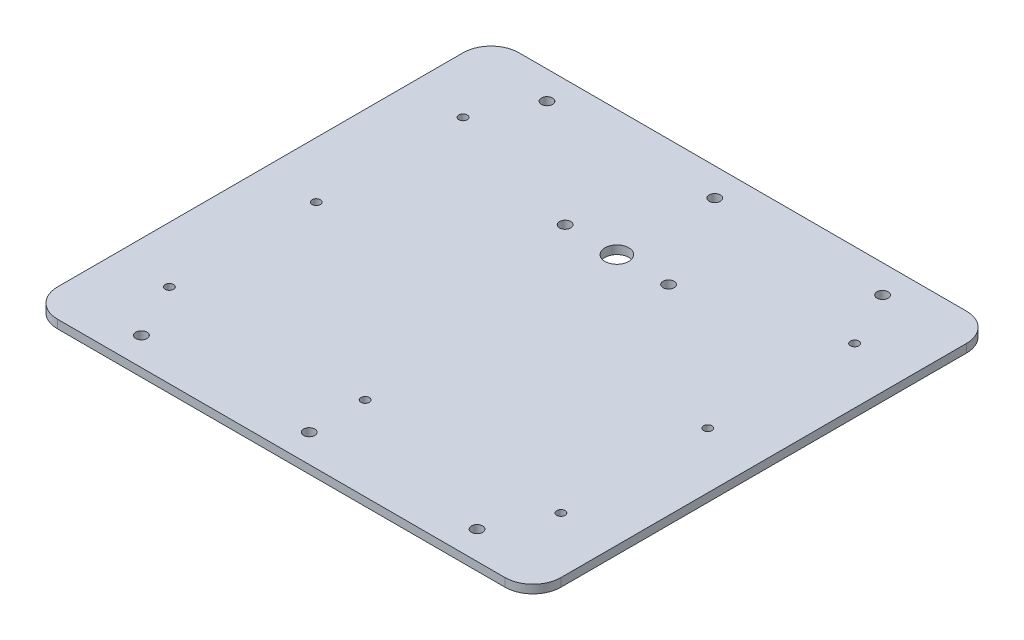
ISO-10303-21;
HEADER;
FILE_DESCRIPTION(('STEP AP214'),'2;1');
FILE_NAME('part.step','',(''),(''),'','','');
FILE_SCHEMA(('AUTOMOTIVE_DESIGN { 1 0 10303 214 1 1 1 1 }'));
ENDSEC;
DATA;
#1=APPLICATION_CONTEXT('core data for automotive mechanical design processes');
#2=APPLICATION_PROTOCOL_DEFINITION('international standard','automotive_design',2000,#1);
#3=PRODUCT_CONTEXT('',#1,'mechanical');
#4=PRODUCT('Part','Part','',(#3));
#5=PRODUCT_RELATED_PRODUCT_CATEGORY('part','',(#4));
#6=PRODUCT_DEFINITION_FORMATION('','',#4);
#7=PRODUCT_DEFINITION_CONTEXT('part definition',#1,'design');
#8=PRODUCT_DEFINITION('design','',#6,#7);
#9=PRODUCT_DEFINITION_SHAPE('','',#8);
#10=(LENGTH_UNIT() NAMED_UNIT(*) SI_UNIT(.MILLI.,.METRE.));
#11=(NAMED_UNIT(*) PLANE_ANGLE_UNIT() SI_UNIT($,.RADIAN.));
#12=(NAMED_UNIT(*) SI_UNIT($,.STERADIAN.) SOLID_ANGLE_UNIT());
#13=UNCERTAINTY_MEASURE_WITH_UNIT(LENGTH_MEASURE(1.E-05),#10,'distance_accuracy_value','');
#14=(GEOMETRIC_REPRESENTATION_CONTEXT(3) GLOBAL_UNCERTAINTY_ASSIGNED_CONTEXT((#13)) GLOBAL_UNIT_ASSIGNED_CONTEXT((#10,
#11,#12)) REPRESENTATION_CONTEXT('',''));
#15=CARTESIAN_POINT('',(0.,0.,0.));
#16=DIRECTION('',(0.,0.,1.));
#17=DIRECTION('',(1.,0.,0.));
#18=AXIS2_PLACEMENT_3D('',#15,#16,#17);
#19=CARTESIAN_POINT('',(-80.,-3.,72.5));
#20=DIRECTION('',(0.,1.,0.));
#21=DIRECTION('',(0.,0.,1.));
#22=AXIS2_PLACEMENT_3D('',#19,#20,#21);
#23=CYLINDRICAL_SURFACE('',#22,10.);
#24=CARTESIAN_POINT('',(-80.,0.,72.5));
#25=DIRECTION('',(0.,1.,0.));
#26=DIRECTION('',(0.,0.,1.));
#27=AXIS2_PLACEMENT_3D('',#24,#25,#26);
#28=CIRCLE('',#27,10.);
#29=CARTESIAN_POINT('',(-90.,0.,72.5));
#30=VERTEX_POINT('',#29);
#31=CARTESIAN_POINT('',(-79.9999999999999,0.,82.5));
#32=VERTEX_POINT('',#31);
#33=EDGE_CURVE('E134',#30,#32,#28,.T.);
#34=ORIENTED_EDGE('',*,*,#33,.F.);
#35=DIRECTION('',(0.,1.,0.));
#36=VECTOR('',#35,1.);
#37=CARTESIAN_POINT('',(-90.,-3.,72.5));
#38=LINE('',#37,#36);
#39=CARTESIAN_POINT('',(-90.,-3.,72.5));
#40=VERTEX_POINT('',#39);
#41=EDGE_CURVE('E11',#40,#30,#38,.T.);
#42=ORIENTED_EDGE('',*,*,#41,.F.);
#43=CARTESIAN_POINT('',(-80.,-3.,72.5));
#44=DIRECTION('',(0.,1.,0.));
#45=DIRECTION('',(0.,0.,1.));
#46=AXIS2_PLACEMENT_3D('',#43,#44,#45);
#47=CIRCLE('',#46,10.);
#48=CARTESIAN_POINT('',(-79.9999999999999,-3.,82.5));
#49=VERTEX_POINT('',#48);
#50=EDGE_CURVE('E155',#40,#49,#47,.T.);
#51=ORIENTED_EDGE('',*,*,#50,.T.);
#52=DIRECTION('',(0.,1.,0.));
#53=VECTOR('',#52,1.);
#54=CARTESIAN_POINT('',(-79.9999999999999,-3.,82.5));
#55=LINE('',#54,#53);
#56=EDGE_CURVE('E40',#49,#32,#55,.T.);
#57=ORIENTED_EDGE('',*,*,#56,.T.);
#58=EDGE_LOOP('',(#34,#42,#51,#57));
#59=FACE_BOUND('',#58,.T.);
#60=ADVANCED_FACE('F37',(#59),#23,.T.);
#61=CARTESIAN_POINT('',(-90.,-3.,-72.5));
#62=DIRECTION('',(-1.,0.,0.));
#63=DIRECTION('',(0.,0.,1.));
#64=AXIS2_PLACEMENT_3D('',#61,#62,#63);
#65=PLANE('',#64);
#66=DIRECTION('',(0.,0.,1.));
#67=VECTOR('',#66,1.);
#68=CARTESIAN_POINT('',(-90.,0.,-72.5));
#69=LINE('',#68,#67);
#70=CARTESIAN_POINT('',(-90.,0.,-72.5));
#71=VERTEX_POINT('',#70);
#72=EDGE_CURVE('E153',#71,#30,#69,.T.);
#73=ORIENTED_EDGE('',*,*,#72,.F.);
#74=DIRECTION('',(0.,1.,0.));
#75=VECTOR('',#74,1.);
#76=CARTESIAN_POINT('',(-90.,-3.,-72.5));
#77=LINE('',#76,#75);
#78=CARTESIAN_POINT('',(-90.,-3.,-72.5));
#79=VERTEX_POINT('',#78);
#80=EDGE_CURVE('E46',#79,#71,#77,.T.);
#81=ORIENTED_EDGE('',*,*,#80,.F.);
#82=DIRECTION('',(0.,0.,1.));
#83=VECTOR('',#82,1.);
#84=CARTESIAN_POINT('',(-90.,-3.,-72.5));
#85=LINE('',#84,#83);
#86=EDGE_CURVE('E124',#79,#40,#85,.T.);
#87=ORIENTED_EDGE('',*,*,#86,.T.);
#88=ORIENTED_EDGE('',*,*,#41,.T.);
#89=EDGE_LOOP('',(#73,#81,#87,#88));
#90=FACE_BOUND('',#89,.T.);
#91=ADVANCED_FACE('F167',(#90),#65,.T.);
#92=CARTESIAN_POINT('',(-80.,-3.,-72.5));
#93=DIRECTION('',(0.,1.,0.));
#94=DIRECTION('',(0.,0.,1.));
#95=AXIS2_PLACEMENT_3D('',#92,#93,#94);
#96=CYLINDRICAL_SURFACE('',#95,9.99999999999999);
#97=CARTESIAN_POINT('',(-80.,0.,-72.5));
#98=DIRECTION('',(0.,1.,0.));
#99=DIRECTION('',(0.,0.,1.));
#100=AXIS2_PLACEMENT_3D('',#97,#98,#99);
#101=CIRCLE('',#100,9.99999999999999);
#102=CARTESIAN_POINT('',(-80.,0.,-82.5));
#103=VERTEX_POINT('',#102);
#104=EDGE_CURVE('E111',#103,#71,#101,.T.);
#105=ORIENTED_EDGE('',*,*,#104,.F.);
#106=DIRECTION('',(0.,1.,0.));
#107=VECTOR('',#106,1.);
#108=CARTESIAN_POINT('',(-80.,-3.,-82.5));
#109=LINE('',#108,#107);
#110=CARTESIAN_POINT('',(-80.,-3.,-82.5));
#111=VERTEX_POINT('',#110);
#112=EDGE_CURVE('E106',#111,#103,#109,.T.);
#113=ORIENTED_EDGE('',*,*,#112,.F.);
#114=CARTESIAN_POINT('',(-80.,-3.,-72.5));
#115=DIRECTION('',(0.,1.,0.));
#116=DIRECTION('',(0.,0.,1.));
#117=AXIS2_PLACEMENT_3D('',#114,#115,#116);
#118=CIRCLE('',#117,9.99999999999999);
#119=EDGE_CURVE('E109',#111,#79,#118,.T.);
#120=ORIENTED_EDGE('',*,*,#119,.T.);
#121=ORIENTED_EDGE('',*,*,#80,.T.);
#122=EDGE_LOOP('',(#105,#113,#120,#121));
#123=FACE_BOUND('',#122,.T.);
#124=ADVANCED_FACE('F108',(#123),#96,.T.);
#125=CARTESIAN_POINT('',(-80.,-3.,-82.5));
#126=DIRECTION('',(0.,0.,-1.));
#127=DIRECTION('',(-1.,0.,0.));
#128=AXIS2_PLACEMENT_3D('',#125,#126,#127);
#129=PLANE('',#128);
#130=DIRECTION('',(-1.,0.,0.));
#131=VECTOR('',#130,1.);
#132=CARTESIAN_POINT('',(-80.,0.,-82.5));
#133=LINE('',#132,#131);
#134=CARTESIAN_POINT('',(80.,0.,-82.5));
#135=VERTEX_POINT('',#134);
#136=EDGE_CURVE('E150',#135,#103,#133,.T.);
#137=ORIENTED_EDGE('',*,*,#136,.F.);
#138=DIRECTION('',(0.,1.,0.));
#139=VECTOR('',#138,1.);
#140=CARTESIAN_POINT('',(80.,-3.,-82.5));
#141=LINE('',#140,#139);
#142=CARTESIAN_POINT('',(80.,-3.,-82.5));
#143=VERTEX_POINT('',#142);
#144=EDGE_CURVE('E116',#143,#135,#141,.T.);
#145=ORIENTED_EDGE('',*,*,#144,.F.);
#146=DIRECTION('',(-1.,0.,0.));
#147=VECTOR('',#146,1.);
#148=CARTESIAN_POINT('',(-80.,-3.,-82.5));
#149=LINE('',#148,#147);
#150=EDGE_CURVE('E122',#143,#111,#149,.T.);
#151=ORIENTED_EDGE('',*,*,#150,.T.);
#152=ORIENTED_EDGE('',*,*,#112,.T.);
#153=EDGE_LOOP('',(#137,#145,#151,#152));
#154=FACE_BOUND('',#153,.T.);
#155=ADVANCED_FACE('F126',(#154),#129,.T.);
#156=CARTESIAN_POINT('',(80.,-3.,-72.5));
#157=DIRECTION('',(0.,1.,0.));
#158=DIRECTION('',(0.,0.,1.));
#159=AXIS2_PLACEMENT_3D('',#156,#157,#158);
#160=CYLINDRICAL_SURFACE('',#159,10.);
#161=CARTESIAN_POINT('',(80.,0.,-72.5));
#162=DIRECTION('',(0.,1.,0.));
#163=DIRECTION('',(0.,0.,-1.));
#164=AXIS2_PLACEMENT_3D('',#161,#162,#163);
#165=CIRCLE('',#164,10.);
#166=CARTESIAN_POINT('',(90.,0.,-72.5));
#167=VERTEX_POINT('',#166);
#168=EDGE_CURVE('E147',#167,#135,#165,.T.);
#169=ORIENTED_EDGE('',*,*,#168,.F.);
#170=DIRECTION('',(0.,1.,0.));
#171=VECTOR('',#170,1.);
#172=CARTESIAN_POINT('',(90.,-3.,-72.5));
#173=LINE('',#172,#171);
#174=CARTESIAN_POINT('',(90.,-3.,-72.5));
#175=VERTEX_POINT('',#174);
#176=EDGE_CURVE('E159',#175,#167,#173,.T.);
#177=ORIENTED_EDGE('',*,*,#176,.F.);
#178=CARTESIAN_POINT('',(80.,-3.,-72.5));
#179=DIRECTION('',(0.,1.,0.));
#180=DIRECTION('',(0.,0.,-1.));
#181=AXIS2_PLACEMENT_3D('',#178,#179,#180);
#182=CIRCLE('',#181,10.);
#183=EDGE_CURVE('E127',#175,#143,#182,.T.);
#184=ORIENTED_EDGE('',*,*,#183,.T.);
#185=ORIENTED_EDGE('',*,*,#144,.T.);
#186=EDGE_LOOP('',(#169,#177,#184,#185));
#187=FACE_BOUND('',#186,.T.);
#188=ADVANCED_FACE('F180',(#187),#160,.T.);
#189=CARTESIAN_POINT('',(90.,-3.,-72.5));
#190=DIRECTION('',(1.,0.,0.));
#191=DIRECTION('',(0.,0.,-1.));
#192=AXIS2_PLACEMENT_3D('',#189,#190,#191);
#193=PLANE('',#192);
#194=DIRECTION('',(0.,0.,-1.));
#195=VECTOR('',#194,1.);
#196=CARTESIAN_POINT('',(90.,0.,-72.5));
#197=LINE('',#196,#195);
#198=CARTESIAN_POINT('',(90.,0.,72.5));
#199=VERTEX_POINT('',#198);
#200=EDGE_CURVE('E144',#199,#167,#197,.T.);
#201=ORIENTED_EDGE('',*,*,#200,.F.);
#202=DIRECTION('',(0.,1.,0.));
#203=VECTOR('',#202,1.);
#204=CARTESIAN_POINT('',(90.,-3.,72.5));
#205=LINE('',#204,#203);
#206=CARTESIAN_POINT('',(90.,-3.,72.5));
#207=VERTEX_POINT('',#206);
#208=EDGE_CURVE('E161',#207,#199,#205,.T.);
#209=ORIENTED_EDGE('',*,*,#208,.F.);
#210=DIRECTION('',(0.,0.,-1.));
#211=VECTOR('',#210,1.);
#212=CARTESIAN_POINT('',(90.,-3.,-72.5));
#213=LINE('',#212,#211);
#214=EDGE_CURVE('E129',#207,#175,#213,.T.);
#215=ORIENTED_EDGE('',*,*,#214,.T.);
#216=ORIENTED_EDGE('',*,*,#176,.T.);
#217=EDGE_LOOP('',(#201,#209,#215,#216));
#218=FACE_BOUND('',#217,.T.);
#219=ADVANCED_FACE('F183',(#218),#193,.T.);
#220=CARTESIAN_POINT('',(80.,-3.,72.5));
#221=DIRECTION('',(0.,1.,0.));
#222=DIRECTION('',(0.,0.,1.));
#223=AXIS2_PLACEMENT_3D('',#220,#221,#222);
#224=CYLINDRICAL_SURFACE('',#223,10.);
#225=CARTESIAN_POINT('',(80.,0.,72.5));
#226=DIRECTION('',(0.,1.,0.));
#227=DIRECTION('',(0.,0.,1.));
#228=AXIS2_PLACEMENT_3D('',#225,#226,#227);
#229=CIRCLE('',#228,10.);
#230=CARTESIAN_POINT('',(79.9999999999999,0.,82.5));
#231=VERTEX_POINT('',#230);
#232=EDGE_CURVE('E141',#231,#199,#229,.T.);
#233=ORIENTED_EDGE('',*,*,#232,.F.);
#234=DIRECTION('',(0.,1.,0.));
#235=VECTOR('',#234,1.);
#236=CARTESIAN_POINT('',(79.9999999999999,-3.,82.5));
#237=LINE('',#236,#235);
#238=CARTESIAN_POINT('',(79.9999999999999,-3.,82.5));
#239=VERTEX_POINT('',#238);
#240=EDGE_CURVE('E162',#239,#231,#237,.T.);
#241=ORIENTED_EDGE('',*,*,#240,.F.);
#242=CARTESIAN_POINT('',(80.,-3.,72.5));
#243=DIRECTION('',(0.,1.,0.));
#244=DIRECTION('',(0.,0.,1.));
#245=AXIS2_PLACEMENT_3D('',#242,#243,#244);
#246=CIRCLE('',#245,10.);
#247=EDGE_CURVE('E369',#239,#207,#246,.T.);
#248=ORIENTED_EDGE('',*,*,#247,.T.);
#249=ORIENTED_EDGE('',*,*,#208,.T.);
#250=EDGE_LOOP('',(#233,#241,#248,#249));
#251=FACE_BOUND('',#250,.T.);
#252=ADVANCED_FACE('F187',(#251),#224,.T.);
#253=CARTESIAN_POINT('',(-79.9999999999999,-3.,82.5));
#254=DIRECTION('',(0.,0.,1.));
#255=DIRECTION('',(1.,0.,0.));
#256=AXIS2_PLACEMENT_3D('',#253,#254,#255);
#257=PLANE('',#256);
#258=DIRECTION('',(1.,0.,0.));
#259=VECTOR('',#258,1.);
#260=CARTESIAN_POINT('',(-79.9999999999999,0.,82.5));
#261=LINE('',#260,#259);
#262=EDGE_CURVE('E137',#32,#231,#261,.T.);
#263=ORIENTED_EDGE('',*,*,#262,.F.);
#264=ORIENTED_EDGE('',*,*,#56,.F.);
#265=DIRECTION('',(1.,0.,0.));
#266=VECTOR('',#265,1.);
#267=CARTESIAN_POINT('',(-79.9999999999999,-3.,82.5));
#268=LINE('',#267,#266);
#269=EDGE_CURVE('E367',#49,#239,#268,.T.);
#270=ORIENTED_EDGE('',*,*,#269,.T.);
#271=ORIENTED_EDGE('',*,*,#240,.T.);
#272=EDGE_LOOP('',(#263,#264,#270,#271));
#273=FACE_BOUND('',#272,.T.);
#274=ADVANCED_FACE('F164',(#273),#257,.T.);
#275=CARTESIAN_POINT('',(-80.,-3.,72.5));
#276=DIRECTION('',(0.,1.,0.));
#277=DIRECTION('',(0.,0.,1.));
#278=AXIS2_PLACEMENT_3D('',#275,#276,#277);
#279=PLANE('',#278);
#280=CARTESIAN_POINT('',(0.,-3.,52.5));
#281=DIRECTION('',(0.,1.,0.));
#282=DIRECTION('',(0.,0.,1.));
#283=AXIS2_PLACEMENT_3D('',#280,#281,#282);
#284=CIRCLE('',#283,1.5);
#285=CARTESIAN_POINT('',(0.,-3.,54.));
#286=VERTEX_POINT('',#285);
#287=EDGE_CURVE('E270',#286,#286,#284,.T.);
#288=ORIENTED_EDGE('',*,*,#287,.T.);
#289=EDGE_LOOP('',(#288));
#290=FACE_BOUND('',#289,.T.);
#291=CARTESIAN_POINT('',(-70.,-3.,52.5));
#292=DIRECTION('',(0.,1.,0.));
#293=DIRECTION('',(0.,0.,1.));
#294=AXIS2_PLACEMENT_3D('',#291,#292,#293);
#295=CIRCLE('',#294,1.5);
#296=CARTESIAN_POINT('',(-70.,-3.,54.));
#297=VERTEX_POINT('',#296);
#298=EDGE_CURVE('E278',#297,#297,#295,.T.);
#299=ORIENTED_EDGE('',*,*,#298,.T.);
#300=EDGE_LOOP('',(#299));
#301=FACE_BOUND('',#300,.T.);
#302=CARTESIAN_POINT('',(-70.,-3.,0.));
#303=DIRECTION('',(0.,1.,0.));
#304=DIRECTION('',(0.,0.,1.));
#305=AXIS2_PLACEMENT_3D('',#302,#303,#304);
#306=CIRCLE('',#305,1.5);
#307=CARTESIAN_POINT('',(-70.,-3.,1.5));
#308=VERTEX_POINT('',#307);
#309=EDGE_CURVE('E284',#308,#308,#306,.T.);
#310=ORIENTED_EDGE('',*,*,#309,.T.);
#311=EDGE_LOOP('',(#310));
#312=FACE_BOUND('',#311,.T.);
#313=CARTESIAN_POINT('',(-70.,-3.,-52.5));
#314=DIRECTION('',(0.,1.,0.));
#315=DIRECTION('',(0.,0.,1.));
#316=AXIS2_PLACEMENT_3D('',#313,#314,#315);
#317=CIRCLE('',#316,1.5);
#318=CARTESIAN_POINT('',(-70.,-3.,-51.));
#319=VERTEX_POINT('',#318);
#320=EDGE_CURVE('E290',#319,#319,#317,.T.);
#321=ORIENTED_EDGE('',*,*,#320,.T.);
#322=EDGE_LOOP('',(#321));
#323=FACE_BOUND('',#322,.T.);
#324=CARTESIAN_POINT('',(70.,-3.,-52.5));
#325=DIRECTION('',(0.,1.,0.));
#326=DIRECTION('',(0.,0.,1.));
#327=AXIS2_PLACEMENT_3D('',#324,#325,#326);
#328=CIRCLE('',#327,1.5);
#329=CARTESIAN_POINT('',(70.,-3.,-51.));
#330=VERTEX_POINT('',#329);
#331=EDGE_CURVE('E296',#330,#330,#328,.T.);
#332=ORIENTED_EDGE('',*,*,#331,.T.);
#333=EDGE_LOOP('',(#332));
#334=FACE_BOUND('',#333,.T.);
#335=CARTESIAN_POINT('',(70.,-3.,52.5));
#336=DIRECTION('',(0.,1.,0.));
#337=DIRECTION('',(0.,0.,1.));
#338=AXIS2_PLACEMENT_3D('',#335,#336,#337);
#339=CIRCLE('',#338,1.5);
#340=CARTESIAN_POINT('',(70.,-3.,54.));
#341=VERTEX_POINT('',#340);
#342=EDGE_CURVE('E302',#341,#341,#339,.T.);
#343=ORIENTED_EDGE('',*,*,#342,.T.);
#344=EDGE_LOOP('',(#343));
#345=FACE_BOUND('',#344,.T.);
#346=CARTESIAN_POINT('',(70.,-3.,0.));
#347=DIRECTION('',(0.,1.,0.));
#348=DIRECTION('',(0.,0.,1.));
#349=AXIS2_PLACEMENT_3D('',#346,#347,#348);
#350=CIRCLE('',#349,1.5);
#351=CARTESIAN_POINT('',(70.,-3.,1.5));
#352=VERTEX_POINT('',#351);
#353=EDGE_CURVE('E308',#352,#352,#350,.T.);
#354=ORIENTED_EDGE('',*,*,#353,.T.);
#355=EDGE_LOOP('',(#354));
#356=FACE_BOUND('',#355,.T.);
#357=CARTESIAN_POINT('',(-18.5,-3.,-37.5));
#358=DIRECTION('',(0.,1.,0.));
#359=DIRECTION('',(0.,0.,1.));
#360=AXIS2_PLACEMENT_3D('',#357,#358,#359);
#361=CIRCLE('',#360,2.);
#362=CARTESIAN_POINT('',(-18.5,-3.,-35.5));
#363=VERTEX_POINT('',#362);
#364=EDGE_CURVE('E314',#363,#363,#361,.T.);
#365=ORIENTED_EDGE('',*,*,#364,.T.);
#366=EDGE_LOOP('',(#365));
#367=FACE_BOUND('',#366,.T.);
#368=CARTESIAN_POINT('',(18.5,-3.,-37.5));
#369=DIRECTION('',(0.,1.,0.));
#370=DIRECTION('',(0.,0.,1.));
#371=AXIS2_PLACEMENT_3D('',#368,#369,#370);
#372=CIRCLE('',#371,2.);
#373=CARTESIAN_POINT('',(18.5,-3.,-35.5));
#374=VERTEX_POINT('',#373);
#375=EDGE_CURVE('E320',#374,#374,#372,.T.);
#376=ORIENTED_EDGE('',*,*,#375,.T.);
#377=EDGE_LOOP('',(#376));
#378=FACE_BOUND('',#377,.T.);
#379=CARTESIAN_POINT('',(0.,-3.,-37.5));
#380=DIRECTION('',(0.,1.,0.));
#381=DIRECTION('',(0.,0.,1.));
#382=AXIS2_PLACEMENT_3D('',#379,#380,#381);
#383=CIRCLE('',#382,4.25);
#384=CARTESIAN_POINT('',(0.,-3.,-33.25));
#385=VERTEX_POINT('',#384);
#386=EDGE_CURVE('E326',#385,#385,#383,.T.);
#387=ORIENTED_EDGE('',*,*,#386,.T.);
#388=EDGE_LOOP('',(#387));
#389=FACE_BOUND('',#388,.T.);
#390=CARTESIAN_POINT('',(60.,-3.,72.5));
#391=DIRECTION('',(0.,1.,0.));
#392=DIRECTION('',(0.,0.,1.));
#393=AXIS2_PLACEMENT_3D('',#390,#391,#392);
#394=CIRCLE('',#393,2.);
#395=CARTESIAN_POINT('',(60.,-3.,74.5));
#396=VERTEX_POINT('',#395);
#397=EDGE_CURVE('E332',#396,#396,#394,.T.);
#398=ORIENTED_EDGE('',*,*,#397,.T.);
#399=EDGE_LOOP('',(#398));
#400=FACE_BOUND('',#399,.T.);
#401=CARTESIAN_POINT('',(-60.,-3.,72.5));
#402=DIRECTION('',(0.,1.,0.));
#403=DIRECTION('',(0.,0.,1.));
#404=AXIS2_PLACEMENT_3D('',#401,#402,#403);
#405=CIRCLE('',#404,2.);
#406=CARTESIAN_POINT('',(-60.,-3.,74.5));
#407=VERTEX_POINT('',#406);
#408=EDGE_CURVE('E338',#407,#407,#405,.T.);
#409=ORIENTED_EDGE('',*,*,#408,.T.);
#410=EDGE_LOOP('',(#409));
#411=FACE_BOUND('',#410,.T.);
#412=CARTESIAN_POINT('',(0.,-3.,72.5));
#413=DIRECTION('',(0.,1.,0.));
#414=DIRECTION('',(0.,0.,1.));
#415=AXIS2_PLACEMENT_3D('',#412,#413,#414);
#416=CIRCLE('',#415,2.);
#417=CARTESIAN_POINT('',(0.,-3.,74.5));
#418=VERTEX_POINT('',#417);
#419=EDGE_CURVE('E344',#418,#418,#416,.T.);
#420=ORIENTED_EDGE('',*,*,#419,.T.);
#421=EDGE_LOOP('',(#420));
#422=FACE_BOUND('',#421,.T.);
#423=CARTESIAN_POINT('',(-60.,-3.,-72.5));
#424=DIRECTION('',(0.,1.,0.));
#425=DIRECTION('',(0.,0.,1.));
#426=AXIS2_PLACEMENT_3D('',#423,#424,#425);
#427=CIRCLE('',#426,2.);
#428=CARTESIAN_POINT('',(-60.,-3.,-70.5));
#429=VERTEX_POINT('',#428);
#430=EDGE_CURVE('E350',#429,#429,#427,.T.);
#431=ORIENTED_EDGE('',*,*,#430,.T.);
#432=EDGE_LOOP('',(#431));
#433=FACE_BOUND('',#432,.T.);
#434=CARTESIAN_POINT('',(60.,-3.,-72.5));
#435=DIRECTION('',(0.,1.,0.));
#436=DIRECTION('',(0.,0.,1.));
#437=AXIS2_PLACEMENT_3D('',#434,#435,#436);
#438=CIRCLE('',#437,2.);
#439=CARTESIAN_POINT('',(60.,-3.,-70.5));
#440=VERTEX_POINT('',#439);
#441=EDGE_CURVE('E356',#440,#440,#438,.T.);
#442=ORIENTED_EDGE('',*,*,#441,.T.);
#443=EDGE_LOOP('',(#442));
#444=FACE_BOUND('',#443,.T.);
#445=CARTESIAN_POINT('',(0.,-3.,-72.5));
#446=DIRECTION('',(0.,1.,0.));
#447=DIRECTION('',(0.,0.,1.));
#448=AXIS2_PLACEMENT_3D('',#445,#446,#447);
#449=CIRCLE('',#448,2.);
#450=CARTESIAN_POINT('',(0.,-3.,-70.5));
#451=VERTEX_POINT('',#450);
#452=EDGE_CURVE('E138',#451,#451,#449,.T.);
#453=ORIENTED_EDGE('',*,*,#452,.T.);
#454=EDGE_LOOP('',(#453));
#455=FACE_BOUND('',#454,.T.);
#456=ORIENTED_EDGE('',*,*,#50,.F.);
#457=ORIENTED_EDGE('',*,*,#86,.F.);
#458=ORIENTED_EDGE('',*,*,#119,.F.);
#459=ORIENTED_EDGE('',*,*,#150,.F.);
#460=ORIENTED_EDGE('',*,*,#183,.F.);
#461=ORIENTED_EDGE('',*,*,#214,.F.);
#462=ORIENTED_EDGE('',*,*,#247,.F.);
#463=ORIENTED_EDGE('',*,*,#269,.F.);
#464=EDGE_LOOP('',(#456,#457,#458,#459,#460,#461,#462,#463));
#465=FACE_BOUND('',#464,.T.);
#466=ADVANCED_FACE('F120',(#290,#301,#312,#323,#334,#345,#356,#367,#378,#389,#400,#411,#422,
#433,#444,#455,#465),#279,.F.);
#467=CARTESIAN_POINT('',(-80.,0.,72.5));
#468=DIRECTION('',(0.,1.,0.));
#469=DIRECTION('',(0.,0.,1.));
#470=AXIS2_PLACEMENT_3D('',#467,#468,#469);
#471=PLANE('',#470);
#472=CARTESIAN_POINT('',(0.,0.,52.5));
#473=DIRECTION('',(0.,1.,0.));
#474=DIRECTION('',(0.,0.,1.));
#475=AXIS2_PLACEMENT_3D('',#472,#473,#474);
#476=CIRCLE('',#475,1.5);
#477=CARTESIAN_POINT('',(0.,0.,54.));
#478=VERTEX_POINT('',#477);
#479=EDGE_CURVE('E273',#478,#478,#476,.T.);
#480=ORIENTED_EDGE('',*,*,#479,.F.);
#481=EDGE_LOOP('',(#480));
#482=FACE_BOUND('',#481,.T.);
#483=CARTESIAN_POINT('',(-70.,0.,52.5));
#484=DIRECTION('',(0.,1.,0.));
#485=DIRECTION('',(0.,0.,1.));
#486=AXIS2_PLACEMENT_3D('',#483,#484,#485);
#487=CIRCLE('',#486,1.5);
#488=CARTESIAN_POINT('',(-70.,0.,54.));
#489=VERTEX_POINT('',#488);
#490=EDGE_CURVE('E275',#489,#489,#487,.T.);
#491=ORIENTED_EDGE('',*,*,#490,.F.);
#492=EDGE_LOOP('',(#491));
#493=FACE_BOUND('',#492,.T.);
#494=CARTESIAN_POINT('',(-70.,0.,0.));
#495=DIRECTION('',(0.,1.,0.));
#496=DIRECTION('',(0.,0.,1.));
#497=AXIS2_PLACEMENT_3D('',#494,#495,#496);
#498=CIRCLE('',#497,1.5);
#499=CARTESIAN_POINT('',(-70.,0.,1.5));
#500=VERTEX_POINT('',#499);
#501=EDGE_CURVE('E281',#500,#500,#498,.T.);
#502=ORIENTED_EDGE('',*,*,#501,.F.);
#503=EDGE_LOOP('',(#502));
#504=FACE_BOUND('',#503,.T.);
#505=CARTESIAN_POINT('',(-70.,0.,-52.5));
#506=DIRECTION('',(0.,1.,0.));
#507=DIRECTION('',(0.,0.,1.));
#508=AXIS2_PLACEMENT_3D('',#505,#506,#507);
#509=CIRCLE('',#508,1.5);
#510=CARTESIAN_POINT('',(-70.,0.,-51.));
#511=VERTEX_POINT('',#510);
#512=EDGE_CURVE('E287',#511,#511,#509,.T.);
#513=ORIENTED_EDGE('',*,*,#512,.F.);
#514=EDGE_LOOP('',(#513));
#515=FACE_BOUND('',#514,.T.);
#516=CARTESIAN_POINT('',(70.,0.,-52.5));
#517=DIRECTION('',(0.,1.,0.));
#518=DIRECTION('',(0.,0.,1.));
#519=AXIS2_PLACEMENT_3D('',#516,#517,#518);
#520=CIRCLE('',#519,1.5);
#521=CARTESIAN_POINT('',(70.,0.,-51.));
#522=VERTEX_POINT('',#521);
#523=EDGE_CURVE('E293',#522,#522,#520,.T.);
#524=ORIENTED_EDGE('',*,*,#523,.F.);
#525=EDGE_LOOP('',(#524));
#526=FACE_BOUND('',#525,.T.);
#527=CARTESIAN_POINT('',(70.,0.,52.5));
#528=DIRECTION('',(0.,1.,0.));
#529=DIRECTION('',(0.,0.,1.));
#530=AXIS2_PLACEMENT_3D('',#527,#528,#529);
#531=CIRCLE('',#530,1.5);
#532=CARTESIAN_POINT('',(70.,0.,54.));
#533=VERTEX_POINT('',#532);
#534=EDGE_CURVE('E299',#533,#533,#531,.T.);
#535=ORIENTED_EDGE('',*,*,#534,.F.);
#536=EDGE_LOOP('',(#535));
#537=FACE_BOUND('',#536,.T.);
#538=CARTESIAN_POINT('',(70.,0.,0.));
#539=DIRECTION('',(0.,1.,0.));
#540=DIRECTION('',(0.,0.,1.));
#541=AXIS2_PLACEMENT_3D('',#538,#539,#540);
#542=CIRCLE('',#541,1.5);
#543=CARTESIAN_POINT('',(70.,0.,1.5));
#544=VERTEX_POINT('',#543);
#545=EDGE_CURVE('E305',#544,#544,#542,.T.);
#546=ORIENTED_EDGE('',*,*,#545,.F.);
#547=EDGE_LOOP('',(#546));
#548=FACE_BOUND('',#547,.T.);
#549=CARTESIAN_POINT('',(-18.5,0.,-37.5));
#550=DIRECTION('',(0.,1.,0.));
#551=DIRECTION('',(0.,0.,1.));
#552=AXIS2_PLACEMENT_3D('',#549,#550,#551);
#553=CIRCLE('',#552,2.);
#554=CARTESIAN_POINT('',(-18.5,0.,-35.5));
#555=VERTEX_POINT('',#554);
#556=EDGE_CURVE('E311',#555,#555,#553,.T.);
#557=ORIENTED_EDGE('',*,*,#556,.F.);
#558=EDGE_LOOP('',(#557));
#559=FACE_BOUND('',#558,.T.);
#560=CARTESIAN_POINT('',(18.5,0.,-37.5));
#561=DIRECTION('',(0.,1.,0.));
#562=DIRECTION('',(0.,0.,1.));
#563=AXIS2_PLACEMENT_3D('',#560,#561,#562);
#564=CIRCLE('',#563,2.);
#565=CARTESIAN_POINT('',(18.5,0.,-35.5));
#566=VERTEX_POINT('',#565);
#567=EDGE_CURVE('E317',#566,#566,#564,.T.);
#568=ORIENTED_EDGE('',*,*,#567,.F.);
#569=EDGE_LOOP('',(#568));
#570=FACE_BOUND('',#569,.T.);
#571=CARTESIAN_POINT('',(0.,0.,-37.5));
#572=DIRECTION('',(0.,1.,0.));
#573=DIRECTION('',(0.,0.,1.));
#574=AXIS2_PLACEMENT_3D('',#571,#572,#573);
#575=CIRCLE('',#574,4.25);
#576=CARTESIAN_POINT('',(0.,0.,-33.25));
#577=VERTEX_POINT('',#576);
#578=EDGE_CURVE('E323',#577,#577,#575,.T.);
#579=ORIENTED_EDGE('',*,*,#578,.F.);
#580=EDGE_LOOP('',(#579));
#581=FACE_BOUND('',#580,.T.);
#582=CARTESIAN_POINT('',(60.,0.,72.5));
#583=DIRECTION('',(0.,1.,0.));
#584=DIRECTION('',(0.,0.,1.));
#585=AXIS2_PLACEMENT_3D('',#582,#583,#584);
#586=CIRCLE('',#585,2.);
#587=CARTESIAN_POINT('',(60.,0.,74.5));
#588=VERTEX_POINT('',#587);
#589=EDGE_CURVE('E329',#588,#588,#586,.T.);
#590=ORIENTED_EDGE('',*,*,#589,.F.);
#591=EDGE_LOOP('',(#590));
#592=FACE_BOUND('',#591,.T.);
#593=CARTESIAN_POINT('',(-60.,0.,72.5));
#594=DIRECTION('',(0.,1.,0.));
#595=DIRECTION('',(0.,0.,1.));
#596=AXIS2_PLACEMENT_3D('',#593,#594,#595);
#597=CIRCLE('',#596,2.);
#598=CARTESIAN_POINT('',(-60.,0.,74.5));
#599=VERTEX_POINT('',#598);
#600=EDGE_CURVE('E335',#599,#599,#597,.T.);
#601=ORIENTED_EDGE('',*,*,#600,.F.);
#602=EDGE_LOOP('',(#601));
#603=FACE_BOUND('',#602,.T.);
#604=CARTESIAN_POINT('',(0.,0.,72.5));
#605=DIRECTION('',(0.,1.,0.));
#606=DIRECTION('',(0.,0.,1.));
#607=AXIS2_PLACEMENT_3D('',#604,#605,#606);
#608=CIRCLE('',#607,2.);
#609=CARTESIAN_POINT('',(0.,0.,74.5));
#610=VERTEX_POINT('',#609);
#611=EDGE_CURVE('E341',#610,#610,#608,.T.);
#612=ORIENTED_EDGE('',*,*,#611,.F.);
#613=EDGE_LOOP('',(#612));
#614=FACE_BOUND('',#613,.T.);
#615=CARTESIAN_POINT('',(-60.,0.,-72.5));
#616=DIRECTION('',(0.,1.,0.));
#617=DIRECTION('',(0.,0.,1.));
#618=AXIS2_PLACEMENT_3D('',#615,#616,#617);
#619=CIRCLE('',#618,2.);
#620=CARTESIAN_POINT('',(-60.,0.,-70.5));
#621=VERTEX_POINT('',#620);
#622=EDGE_CURVE('E347',#621,#621,#619,.T.);
#623=ORIENTED_EDGE('',*,*,#622,.F.);
#624=EDGE_LOOP('',(#623));
#625=FACE_BOUND('',#624,.T.);
#626=CARTESIAN_POINT('',(60.,0.,-72.5));
#627=DIRECTION('',(0.,1.,0.));
#628=DIRECTION('',(0.,0.,1.));
#629=AXIS2_PLACEMENT_3D('',#626,#627,#628);
#630=CIRCLE('',#629,2.);
#631=CARTESIAN_POINT('',(60.,0.,-70.5));
#632=VERTEX_POINT('',#631);
#633=EDGE_CURVE('E353',#632,#632,#630,.T.);
#634=ORIENTED_EDGE('',*,*,#633,.F.);
#635=EDGE_LOOP('',(#634));
#636=FACE_BOUND('',#635,.T.);
#637=CARTESIAN_POINT('',(0.,0.,-72.5));
#638=DIRECTION('',(0.,1.,0.));
#639=DIRECTION('',(0.,0.,1.));
#640=AXIS2_PLACEMENT_3D('',#637,#638,#639);
#641=CIRCLE('',#640,2.);
#642=CARTESIAN_POINT('',(0.,0.,-70.5));
#643=VERTEX_POINT('',#642);
#644=EDGE_CURVE('E359',#643,#643,#641,.T.);
#645=ORIENTED_EDGE('',*,*,#644,.F.);
#646=EDGE_LOOP('',(#645));
#647=FACE_BOUND('',#646,.T.);
#648=ORIENTED_EDGE('',*,*,#33,.T.);
#649=ORIENTED_EDGE('',*,*,#262,.T.);
#650=ORIENTED_EDGE('',*,*,#232,.T.);
#651=ORIENTED_EDGE('',*,*,#200,.T.);
#652=ORIENTED_EDGE('',*,*,#168,.T.);
#653=ORIENTED_EDGE('',*,*,#136,.T.);
#654=ORIENTED_EDGE('',*,*,#104,.T.);
#655=ORIENTED_EDGE('',*,*,#72,.T.);
#656=EDGE_LOOP('',(#648,#649,#650,#651,#652,#653,#654,#655));
#657=FACE_BOUND('',#656,.T.);
#658=ADVANCED_FACE('F166',(#482,#493,#504,#515,#526,#537,#548,#559,#570,#581,#592,#603,#614,
#625,#636,#647,#657),#471,.T.);
#659=CARTESIAN_POINT('',(0.,-3.,-72.5));
#660=DIRECTION('',(0.,1.,0.));
#661=DIRECTION('',(0.,0.,1.));
#662=AXIS2_PLACEMENT_3D('',#659,#660,#661);
#663=CYLINDRICAL_SURFACE('',#662,2.);
#664=ORIENTED_EDGE('',*,*,#452,.F.);
#665=EDGE_LOOP('',(#664));
#666=FACE_BOUND('',#665,.T.);
#667=ORIENTED_EDGE('',*,*,#644,.T.);
#668=EDGE_LOOP('',(#667));
#669=FACE_BOUND('',#668,.T.);
#670=ADVANCED_FACE('F199',(#666,#669),#663,.F.);
#671=CARTESIAN_POINT('',(60.,-3.,-72.5));
#672=DIRECTION('',(0.,1.,0.));
#673=DIRECTION('',(0.,0.,1.));
#674=AXIS2_PLACEMENT_3D('',#671,#672,#673);
#675=CYLINDRICAL_SURFACE('',#674,2.);
#676=ORIENTED_EDGE('',*,*,#441,.F.);
#677=EDGE_LOOP('',(#676));
#678=FACE_BOUND('',#677,.T.);
#679=ORIENTED_EDGE('',*,*,#633,.T.);
#680=EDGE_LOOP('',(#679));
#681=FACE_BOUND('',#680,.T.);
#682=ADVANCED_FACE('F206',(#678,#681),#675,.F.);
#683=CARTESIAN_POINT('',(-60.,-3.,-72.5));
#684=DIRECTION('',(0.,1.,0.));
#685=DIRECTION('',(0.,0.,1.));
#686=AXIS2_PLACEMENT_3D('',#683,#684,#685);
#687=CYLINDRICAL_SURFACE('',#686,2.);
#688=ORIENTED_EDGE('',*,*,#430,.F.);
#689=EDGE_LOOP('',(#688));
#690=FACE_BOUND('',#689,.T.);
#691=ORIENTED_EDGE('',*,*,#622,.T.);
#692=EDGE_LOOP('',(#691));
#693=FACE_BOUND('',#692,.T.);
#694=ADVANCED_FACE('F210',(#690,#693),#687,.F.);
#695=CARTESIAN_POINT('',(0.,-3.,72.5));
#696=DIRECTION('',(0.,1.,0.));
#697=DIRECTION('',(0.,0.,1.));
#698=AXIS2_PLACEMENT_3D('',#695,#696,#697);
#699=CYLINDRICAL_SURFACE('',#698,2.);
#700=ORIENTED_EDGE('',*,*,#419,.F.);
#701=EDGE_LOOP('',(#700));
#702=FACE_BOUND('',#701,.T.);
#703=ORIENTED_EDGE('',*,*,#611,.T.);
#704=EDGE_LOOP('',(#703));
#705=FACE_BOUND('',#704,.T.);
#706=ADVANCED_FACE('F214',(#702,#705),#699,.F.);
#707=CARTESIAN_POINT('',(-60.,-3.,72.5));
#708=DIRECTION('',(0.,1.,0.));
#709=DIRECTION('',(0.,0.,1.));
#710=AXIS2_PLACEMENT_3D('',#707,#708,#709);
#711=CYLINDRICAL_SURFACE('',#710,2.);
#712=ORIENTED_EDGE('',*,*,#408,.F.);
#713=EDGE_LOOP('',(#712));
#714=FACE_BOUND('',#713,.T.);
#715=ORIENTED_EDGE('',*,*,#600,.T.);
#716=EDGE_LOOP('',(#715));
#717=FACE_BOUND('',#716,.T.);
#718=ADVANCED_FACE('F218',(#714,#717),#711,.F.);
#719=CARTESIAN_POINT('',(60.,-3.,72.5));
#720=DIRECTION('',(0.,1.,0.));
#721=DIRECTION('',(0.,0.,1.));
#722=AXIS2_PLACEMENT_3D('',#719,#720,#721);
#723=CYLINDRICAL_SURFACE('',#722,2.);
#724=ORIENTED_EDGE('',*,*,#397,.F.);
#725=EDGE_LOOP('',(#724));
#726=FACE_BOUND('',#725,.T.);
#727=ORIENTED_EDGE('',*,*,#589,.T.);
#728=EDGE_LOOP('',(#727));
#729=FACE_BOUND('',#728,.T.);
#730=ADVANCED_FACE('F222',(#726,#729),#723,.F.);
#731=CARTESIAN_POINT('',(0.,-3.,-37.5));
#732=DIRECTION('',(0.,1.,0.));
#733=DIRECTION('',(0.,0.,1.));
#734=AXIS2_PLACEMENT_3D('',#731,#732,#733);
#735=CYLINDRICAL_SURFACE('',#734,4.25);
#736=ORIENTED_EDGE('',*,*,#386,.F.);
#737=EDGE_LOOP('',(#736));
#738=FACE_BOUND('',#737,.T.);
#739=ORIENTED_EDGE('',*,*,#578,.T.);
#740=EDGE_LOOP('',(#739));
#741=FACE_BOUND('',#740,.T.);
#742=ADVANCED_FACE('F226',(#738,#741),#735,.F.);
#743=CARTESIAN_POINT('',(18.5,-3.,-37.5));
#744=DIRECTION('',(0.,1.,0.));
#745=DIRECTION('',(0.,0.,1.));
#746=AXIS2_PLACEMENT_3D('',#743,#744,#745);
#747=CYLINDRICAL_SURFACE('',#746,2.);
#748=ORIENTED_EDGE('',*,*,#375,.F.);
#749=EDGE_LOOP('',(#748));
#750=FACE_BOUND('',#749,.T.);
#751=ORIENTED_EDGE('',*,*,#567,.T.);
#752=EDGE_LOOP('',(#751));
#753=FACE_BOUND('',#752,.T.);
#754=ADVANCED_FACE('F230',(#750,#753),#747,.F.);
#755=CARTESIAN_POINT('',(-18.5,-3.,-37.5));
#756=DIRECTION('',(0.,1.,0.));
#757=DIRECTION('',(0.,0.,1.));
#758=AXIS2_PLACEMENT_3D('',#755,#756,#757);
#759=CYLINDRICAL_SURFACE('',#758,2.);
#760=ORIENTED_EDGE('',*,*,#364,.F.);
#761=EDGE_LOOP('',(#760));
#762=FACE_BOUND('',#761,.T.);
#763=ORIENTED_EDGE('',*,*,#556,.T.);
#764=EDGE_LOOP('',(#763));
#765=FACE_BOUND('',#764,.T.);
#766=ADVANCED_FACE('F234',(#762,#765),#759,.F.);
#767=CARTESIAN_POINT('',(70.,-3.,0.));
#768=DIRECTION('',(0.,1.,0.));
#769=DIRECTION('',(0.,0.,1.));
#770=AXIS2_PLACEMENT_3D('',#767,#768,#769);
#771=CYLINDRICAL_SURFACE('',#770,1.5);
#772=ORIENTED_EDGE('',*,*,#353,.F.);
#773=EDGE_LOOP('',(#772));
#774=FACE_BOUND('',#773,.T.);
#775=ORIENTED_EDGE('',*,*,#545,.T.);
#776=EDGE_LOOP('',(#775));
#777=FACE_BOUND('',#776,.T.);
#778=ADVANCED_FACE('F238',(#774,#777),#771,.F.);
#779=CARTESIAN_POINT('',(70.,-3.,52.5));
#780=DIRECTION('',(0.,1.,0.));
#781=DIRECTION('',(0.,0.,1.));
#782=AXIS2_PLACEMENT_3D('',#779,#780,#781);
#783=CYLINDRICAL_SURFACE('',#782,1.5);
#784=ORIENTED_EDGE('',*,*,#342,.F.);
#785=EDGE_LOOP('',(#784));
#786=FACE_BOUND('',#785,.T.);
#787=ORIENTED_EDGE('',*,*,#534,.T.);
#788=EDGE_LOOP('',(#787));
#789=FACE_BOUND('',#788,.T.);
#790=ADVANCED_FACE('F242',(#786,#789),#783,.F.);
#791=CARTESIAN_POINT('',(70.,-3.,-52.5));
#792=DIRECTION('',(0.,1.,0.));
#793=DIRECTION('',(0.,0.,1.));
#794=AXIS2_PLACEMENT_3D('',#791,#792,#793);
#795=CYLINDRICAL_SURFACE('',#794,1.5);
#796=ORIENTED_EDGE('',*,*,#331,.F.);
#797=EDGE_LOOP('',(#796));
#798=FACE_BOUND('',#797,.T.);
#799=ORIENTED_EDGE('',*,*,#523,.T.);
#800=EDGE_LOOP('',(#799));
#801=FACE_BOUND('',#800,.T.);
#802=ADVANCED_FACE('F246',(#798,#801),#795,.F.);
#803=CARTESIAN_POINT('',(-70.,-3.,-52.5));
#804=DIRECTION('',(0.,1.,0.));
#805=DIRECTION('',(0.,0.,1.));
#806=AXIS2_PLACEMENT_3D('',#803,#804,#805);
#807=CYLINDRICAL_SURFACE('',#806,1.5);
#808=ORIENTED_EDGE('',*,*,#320,.F.);
#809=EDGE_LOOP('',(#808));
#810=FACE_BOUND('',#809,.T.);
#811=ORIENTED_EDGE('',*,*,#512,.T.);
#812=EDGE_LOOP('',(#811));
#813=FACE_BOUND('',#812,.T.);
#814=ADVANCED_FACE('F250',(#810,#813),#807,.F.);
#815=CARTESIAN_POINT('',(-70.,-3.,0.));
#816=DIRECTION('',(0.,1.,0.));
#817=DIRECTION('',(0.,0.,1.));
#818=AXIS2_PLACEMENT_3D('',#815,#816,#817);
#819=CYLINDRICAL_SURFACE('',#818,1.5);
#820=ORIENTED_EDGE('',*,*,#309,.F.);
#821=EDGE_LOOP('',(#820));
#822=FACE_BOUND('',#821,.T.);
#823=ORIENTED_EDGE('',*,*,#501,.T.);
#824=EDGE_LOOP('',(#823));
#825=FACE_BOUND('',#824,.T.);
#826=ADVANCED_FACE('F254',(#822,#825),#819,.F.);
#827=CARTESIAN_POINT('',(-70.,-3.,52.5));
#828=DIRECTION('',(0.,1.,0.));
#829=DIRECTION('',(0.,0.,1.));
#830=AXIS2_PLACEMENT_3D('',#827,#828,#829);
#831=CYLINDRICAL_SURFACE('',#830,1.5);
#832=ORIENTED_EDGE('',*,*,#298,.F.);
#833=EDGE_LOOP('',(#832));
#834=FACE_BOUND('',#833,.T.);
#835=ORIENTED_EDGE('',*,*,#490,.T.);
#836=EDGE_LOOP('',(#835));
#837=FACE_BOUND('',#836,.T.);
#838=ADVANCED_FACE('F258',(#834,#837),#831,.F.);
#839=CARTESIAN_POINT('',(0.,-3.,52.5));
#840=DIRECTION('',(0.,1.,0.));
#841=DIRECTION('',(0.,0.,1.));
#842=AXIS2_PLACEMENT_3D('',#839,#840,#841);
#843=CYLINDRICAL_SURFACE('',#842,1.5);
#844=ORIENTED_EDGE('',*,*,#287,.F.);
#845=EDGE_LOOP('',(#844));
#846=FACE_BOUND('',#845,.T.);
#847=ORIENTED_EDGE('',*,*,#479,.T.);
#848=EDGE_LOOP('',(#847));
#849=FACE_BOUND('',#848,.T.);
#850=ADVANCED_FACE('F262',(#846,#849),#843,.F.);
#851=CLOSED_SHELL('',(#60,#91,#124,#155,#188,#219,#252,#274,#466,#658,#670,#682,#694,#706,#718,
#730,#742,#754,#766,#778,#790,#802,#814,#826,#838,#850));
#852=MANIFOLD_SOLID_BREP('B2',#851);
#853=ADVANCED_BREP_SHAPE_REPRESENTATION('',(#18,#852),#14);
#854=SHAPE_DEFINITION_REPRESENTATION(#9,#853);
ENDSEC;
END-ISO-10303-21;
